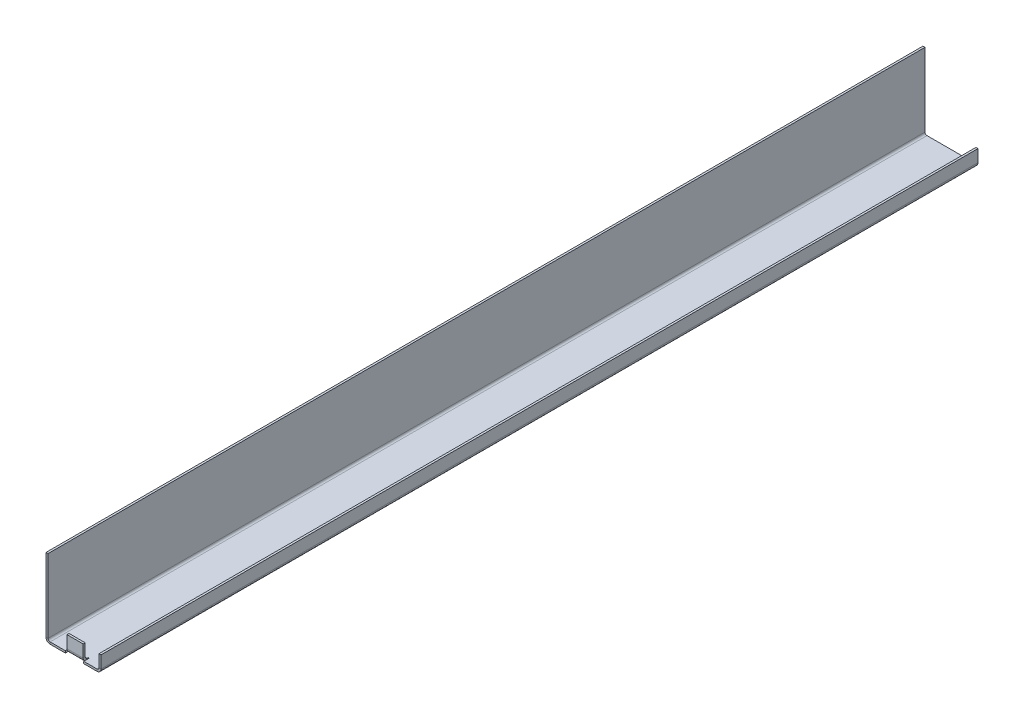
ISO-10303-21;
HEADER;
FILE_DESCRIPTION(('STEP AP214'),'2;1');
FILE_NAME('part.step','',(''),(''),'','','');
FILE_SCHEMA(('AUTOMOTIVE_DESIGN { 1 0 10303 214 1 1 1 1 }'));
ENDSEC;
DATA;
#1=APPLICATION_CONTEXT('core data for automotive mechanical design processes');
#2=APPLICATION_PROTOCOL_DEFINITION('international standard','automotive_design',2000,#1);
#3=PRODUCT_CONTEXT('',#1,'mechanical');
#4=PRODUCT('Part','Part','',(#3));
#5=PRODUCT_RELATED_PRODUCT_CATEGORY('part','',(#4));
#6=PRODUCT_DEFINITION_FORMATION('','',#4);
#7=PRODUCT_DEFINITION_CONTEXT('part definition',#1,'design');
#8=PRODUCT_DEFINITION('design','',#6,#7);
#9=PRODUCT_DEFINITION_SHAPE('','',#8);
#10=(LENGTH_UNIT() NAMED_UNIT(*) SI_UNIT(.MILLI.,.METRE.));
#11=(NAMED_UNIT(*) PLANE_ANGLE_UNIT() SI_UNIT($,.RADIAN.));
#12=(NAMED_UNIT(*) SI_UNIT($,.STERADIAN.) SOLID_ANGLE_UNIT());
#13=UNCERTAINTY_MEASURE_WITH_UNIT(LENGTH_MEASURE(1.E-05),#10,'distance_accuracy_value','');
#14=(GEOMETRIC_REPRESENTATION_CONTEXT(3) GLOBAL_UNCERTAINTY_ASSIGNED_CONTEXT((#13)) GLOBAL_UNIT_ASSIGNED_CONTEXT((#10,
#11,#12)) REPRESENTATION_CONTEXT('',''));
#15=CARTESIAN_POINT('',(0.,0.,0.));
#16=DIRECTION('',(0.,0.,1.));
#17=DIRECTION('',(1.,0.,0.));
#18=AXIS2_PLACEMENT_3D('',#15,#16,#17);
#19=CARTESIAN_POINT('',(82.55,6.35,1365.25));
#20=DIRECTION('',(0.,0.,1.));
#21=DIRECTION('',(1.,0.,0.));
#22=AXIS2_PLACEMENT_3D('',#19,#20,#21);
#23=PLANE('',#22);
#24=DIRECTION('',(1.,0.,0.));
#25=VECTOR('',#24,1.);
#26=CARTESIAN_POINT('',(0.,3.175,1365.25));
#27=LINE('',#26,#25);
#28=CARTESIAN_POINT('',(79.375,3.175,1365.25));
#29=VERTEX_POINT('',#28);
#30=CARTESIAN_POINT('',(58.7375,3.175,1365.25));
#31=VERTEX_POINT('',#30);
#32=EDGE_CURVE('E357',#29,#31,#27,.F.);
#33=ORIENTED_EDGE('',*,*,#32,.T.);
#34=DIRECTION('',(0.,-1.,0.));
#35=VECTOR('',#34,1.);
#36=CARTESIAN_POINT('',(58.7375,3.17499999999996,1365.25));
#37=LINE('',#36,#35);
#38=CARTESIAN_POINT('',(58.7375,0.,1365.25));
#39=VERTEX_POINT('',#38);
#40=EDGE_CURVE('E285',#31,#39,#37,.T.);
#41=ORIENTED_EDGE('',*,*,#40,.T.);
#42=DIRECTION('',(-1.,0.,0.));
#43=VECTOR('',#42,1.);
#44=CARTESIAN_POINT('',(0.,0.,1365.25));
#45=LINE('',#44,#43);
#46=CARTESIAN_POINT('',(79.375,0.,1365.25));
#47=VERTEX_POINT('',#46);
#48=EDGE_CURVE('E339',#47,#39,#45,.T.);
#49=ORIENTED_EDGE('',*,*,#48,.F.);
#50=DIRECTION('',(0.,1.,0.));
#51=VECTOR('',#50,1.);
#52=CARTESIAN_POINT('',(79.375,0.,1365.25));
#53=LINE('',#52,#51);
#54=EDGE_CURVE('E13',#47,#29,#53,.T.);
#55=ORIENTED_EDGE('',*,*,#54,.T.);
#56=EDGE_LOOP('',(#33,#41,#49,#55));
#57=FACE_BOUND('',#56,.T.);
#58=ADVANCED_FACE('F55',(#57),#23,.T.);
#59=CARTESIAN_POINT('',(30.1625,0.,1365.25));
#60=VERTEX_POINT('',#59);
#61=CARTESIAN_POINT('',(6.35,0.,1365.25));
#62=VERTEX_POINT('',#61);
#63=EDGE_CURVE('E338',#60,#62,#45,.T.);
#64=ORIENTED_EDGE('',*,*,#63,.F.);
#65=DIRECTION('',(0.,-1.,0.));
#66=VECTOR('',#65,1.);
#67=CARTESIAN_POINT('',(30.1625,3.17499999999996,1365.25));
#68=LINE('',#67,#66);
#69=CARTESIAN_POINT('',(30.1625,3.17499999999996,1365.25));
#70=VERTEX_POINT('',#69);
#71=EDGE_CURVE('E304',#70,#60,#68,.T.);
#72=ORIENTED_EDGE('',*,*,#71,.F.);
#73=CARTESIAN_POINT('',(6.35,3.175,1365.25));
#74=VERTEX_POINT('',#73);
#75=EDGE_CURVE('E356',#70,#74,#27,.F.);
#76=ORIENTED_EDGE('',*,*,#75,.T.);
#77=DIRECTION('',(0.,-1.,0.));
#78=VECTOR('',#77,1.);
#79=CARTESIAN_POINT('',(6.35,3.175,1365.25));
#80=LINE('',#79,#78);
#81=EDGE_CURVE('E433',#74,#62,#80,.T.);
#82=ORIENTED_EDGE('',*,*,#81,.T.);
#83=EDGE_LOOP('',(#64,#72,#76,#82));
#84=FACE_BOUND('',#83,.T.);
#85=ADVANCED_FACE('F501',(#84),#23,.T.);
#86=CARTESIAN_POINT('',(0.,0.,1365.25));
#87=DIRECTION('',(0.,-1.,0.));
#88=DIRECTION('',(0.,0.,-1.));
#89=AXIS2_PLACEMENT_3D('',#86,#87,#88);
#90=PLANE('',#89);
#91=ORIENTED_EDGE('',*,*,#48,.T.);
#92=DIRECTION('',(0.,0.,-1.));
#93=VECTOR('',#92,1.);
#94=CARTESIAN_POINT('',(58.7375,0.,1365.25));
#95=LINE('',#94,#93);
#96=CARTESIAN_POINT('',(58.7375,0.,1356.5505));
#97=VERTEX_POINT('',#96);
#98=EDGE_CURVE('E70',#39,#97,#95,.T.);
#99=ORIENTED_EDGE('',*,*,#98,.T.);
#100=DIRECTION('',(-1.,0.,0.));
#101=VECTOR('',#100,1.);
#102=CARTESIAN_POINT('',(0.,0.,1356.5505));
#103=LINE('',#102,#101);
#104=CARTESIAN_POINT('',(57.15,0.,1356.5505));
#105=VERTEX_POINT('',#104);
#106=EDGE_CURVE('E74',#97,#105,#103,.T.);
#107=ORIENTED_EDGE('',*,*,#106,.T.);
#108=DIRECTION('',(0.,0.,1.));
#109=VECTOR('',#108,1.);
#110=CARTESIAN_POINT('',(57.15,0.,1365.25));
#111=LINE('',#110,#109);
#112=CARTESIAN_POINT('',(57.15,0.,1358.138));
#113=VERTEX_POINT('',#112);
#114=EDGE_CURVE('E321',#105,#113,#111,.T.);
#115=ORIENTED_EDGE('',*,*,#114,.T.);
#116=DIRECTION('',(1.,0.,0.));
#117=VECTOR('',#116,1.);
#118=CARTESIAN_POINT('',(57.15,0.,1358.138));
#119=LINE('',#118,#117);
#120=CARTESIAN_POINT('',(31.75,0.,1358.138));
#121=VERTEX_POINT('',#120);
#122=EDGE_CURVE('E257',#113,#121,#119,.F.);
#123=ORIENTED_EDGE('',*,*,#122,.T.);
#124=DIRECTION('',(0.,0.,-1.));
#125=VECTOR('',#124,1.);
#126=CARTESIAN_POINT('',(31.75,0.,1365.25));
#127=LINE('',#126,#125);
#128=CARTESIAN_POINT('',(31.75,0.,1356.5505));
#129=VERTEX_POINT('',#128);
#130=EDGE_CURVE('E319',#121,#129,#127,.T.);
#131=ORIENTED_EDGE('',*,*,#130,.T.);
#132=DIRECTION('',(-1.,0.,0.));
#133=VECTOR('',#132,1.);
#134=CARTESIAN_POINT('',(0.,0.,1356.5505));
#135=LINE('',#134,#133);
#136=CARTESIAN_POINT('',(30.1625,0.,1356.5505));
#137=VERTEX_POINT('',#136);
#138=EDGE_CURVE('E317',#129,#137,#135,.T.);
#139=ORIENTED_EDGE('',*,*,#138,.T.);
#140=DIRECTION('',(0.,0.,1.));
#141=VECTOR('',#140,1.);
#142=CARTESIAN_POINT('',(30.1625,0.,1365.25));
#143=LINE('',#142,#141);
#144=EDGE_CURVE('E284',#137,#60,#143,.T.);
#145=ORIENTED_EDGE('',*,*,#144,.T.);
#146=ORIENTED_EDGE('',*,*,#63,.T.);
#147=DIRECTION('',(0.,0.,-1.));
#148=VECTOR('',#147,1.);
#149=CARTESIAN_POINT('',(6.35,0.,1365.25));
#150=LINE('',#149,#148);
#151=CARTESIAN_POINT('',(6.35,0.,0.));
#152=VERTEX_POINT('',#151);
#153=EDGE_CURVE('E419',#62,#152,#150,.T.);
#154=ORIENTED_EDGE('',*,*,#153,.T.);
#155=DIRECTION('',(-1.,0.,0.));
#156=VECTOR('',#155,1.);
#157=CARTESIAN_POINT('',(0.,0.,0.));
#158=LINE('',#157,#156);
#159=CARTESIAN_POINT('',(79.375,0.,0.));
#160=VERTEX_POINT('',#159);
#161=EDGE_CURVE('E375',#160,#152,#158,.T.);
#162=ORIENTED_EDGE('',*,*,#161,.F.);
#163=DIRECTION('',(0.,0.,-1.));
#164=VECTOR('',#163,1.);
#165=CARTESIAN_POINT('',(79.375,0.,1365.25));
#166=LINE('',#165,#164);
#167=EDGE_CURVE('E416',#47,#160,#166,.T.);
#168=ORIENTED_EDGE('',*,*,#167,.F.);
#169=EDGE_LOOP('',(#91,#99,#107,#115,#123,#131,#139,#145,#146,#154,#162,#168));
#170=FACE_BOUND('',#169,.T.);
#171=ADVANCED_FACE('F483',(#170),#90,.T.);
#172=CARTESIAN_POINT('',(0.,3.175,1365.25));
#173=DIRECTION('',(0.,-1.,0.));
#174=DIRECTION('',(0.,0.,-1.));
#175=AXIS2_PLACEMENT_3D('',#172,#173,#174);
#176=PLANE('',#175);
#177=DIRECTION('',(0.,0.,-1.));
#178=VECTOR('',#177,1.);
#179=CARTESIAN_POINT('',(58.7375,3.17499999999996,1365.25));
#180=LINE('',#179,#178);
#181=CARTESIAN_POINT('',(58.7375,3.175,1356.5505));
#182=VERTEX_POINT('',#181);
#183=EDGE_CURVE('E281',#31,#182,#180,.T.);
#184=ORIENTED_EDGE('',*,*,#183,.F.);
#185=ORIENTED_EDGE('',*,*,#32,.F.);
#186=DIRECTION('',(0.,0.,-1.));
#187=VECTOR('',#186,1.);
#188=CARTESIAN_POINT('',(79.375,3.175,1365.25));
#189=LINE('',#188,#187);
#190=CARTESIAN_POINT('',(79.375,3.175,0.));
#191=VERTEX_POINT('',#190);
#192=EDGE_CURVE('E403',#29,#191,#189,.T.);
#193=ORIENTED_EDGE('',*,*,#192,.T.);
#194=DIRECTION('',(1.,0.,0.));
#195=VECTOR('',#194,1.);
#196=CARTESIAN_POINT('',(0.,3.175,0.));
#197=LINE('',#196,#195);
#198=CARTESIAN_POINT('',(6.35,3.175,0.));
#199=VERTEX_POINT('',#198);
#200=EDGE_CURVE('E393',#191,#199,#197,.F.);
#201=ORIENTED_EDGE('',*,*,#200,.T.);
#202=DIRECTION('',(0.,0.,-1.));
#203=VECTOR('',#202,1.);
#204=CARTESIAN_POINT('',(6.35,3.175,1365.25));
#205=LINE('',#204,#203);
#206=EDGE_CURVE('E400',#74,#199,#205,.T.);
#207=ORIENTED_EDGE('',*,*,#206,.F.);
#208=ORIENTED_EDGE('',*,*,#75,.F.);
#209=DIRECTION('',(0.,0.,1.));
#210=VECTOR('',#209,1.);
#211=CARTESIAN_POINT('',(30.1625,3.17499999999993,1356.5505));
#212=LINE('',#211,#210);
#213=CARTESIAN_POINT('',(30.1625,3.175,1356.5505));
#214=VERTEX_POINT('',#213);
#215=EDGE_CURVE('E301',#214,#70,#212,.T.);
#216=ORIENTED_EDGE('',*,*,#215,.F.);
#217=DIRECTION('',(-1.,0.,0.));
#218=VECTOR('',#217,1.);
#219=CARTESIAN_POINT('',(31.75,3.17499999999993,1356.5505));
#220=LINE('',#219,#218);
#221=CARTESIAN_POINT('',(31.75,3.175,1356.5505));
#222=VERTEX_POINT('',#221);
#223=EDGE_CURVE('E297',#222,#214,#220,.T.);
#224=ORIENTED_EDGE('',*,*,#223,.F.);
#225=DIRECTION('',(0.,0.,-1.));
#226=VECTOR('',#225,1.);
#227=CARTESIAN_POINT('',(31.75,3.17499999999993,1358.138));
#228=LINE('',#227,#226);
#229=CARTESIAN_POINT('',(31.75,3.17499999999993,1358.138));
#230=VERTEX_POINT('',#229);
#231=EDGE_CURVE('E294',#230,#222,#228,.T.);
#232=ORIENTED_EDGE('',*,*,#231,.F.);
#233=DIRECTION('',(1.,0.,0.));
#234=VECTOR('',#233,1.);
#235=CARTESIAN_POINT('',(57.15,3.17499999999993,1358.138));
#236=LINE('',#235,#234);
#237=CARTESIAN_POINT('',(57.15,3.17499999999993,1358.138));
#238=VERTEX_POINT('',#237);
#239=EDGE_CURVE('E270',#238,#230,#236,.F.);
#240=ORIENTED_EDGE('',*,*,#239,.F.);
#241=DIRECTION('',(0.,0.,1.));
#242=VECTOR('',#241,1.);
#243=CARTESIAN_POINT('',(57.15,3.17499999999993,1356.5505));
#244=LINE('',#243,#242);
#245=CARTESIAN_POINT('',(57.15,3.175,1356.5505));
#246=VERTEX_POINT('',#245);
#247=EDGE_CURVE('E290',#246,#238,#244,.T.);
#248=ORIENTED_EDGE('',*,*,#247,.F.);
#249=DIRECTION('',(-1.,0.,0.));
#250=VECTOR('',#249,1.);
#251=CARTESIAN_POINT('',(58.7375,3.17499999999993,1356.5505));
#252=LINE('',#251,#250);
#253=EDGE_CURVE('E286',#182,#246,#252,.T.);
#254=ORIENTED_EDGE('',*,*,#253,.F.);
#255=EDGE_LOOP('',(#184,#185,#193,#201,#207,#208,#216,#224,#232,#240,#248,#254));
#256=FACE_BOUND('',#255,.T.);
#257=ADVANCED_FACE('F471',(#256),#176,.F.);
#258=CARTESIAN_POINT('',(79.375,0.,1365.25));
#259=DIRECTION('',(0.,0.,1.));
#260=DIRECTION('',(1.,0.,0.));
#261=AXIS2_PLACEMENT_3D('',#258,#259,#260);
#262=PLANE('',#261);
#263=ORIENTED_EDGE('',*,*,#54,.F.);
#264=CARTESIAN_POINT('',(79.375,6.35,1365.25));
#265=DIRECTION('',(0.,0.,1.));
#266=DIRECTION('',(1.,0.,0.));
#267=AXIS2_PLACEMENT_3D('',#264,#265,#266);
#268=CIRCLE('',#267,6.35);
#269=CARTESIAN_POINT('',(85.725,6.35,1365.25));
#270=VERTEX_POINT('',#269);
#271=EDGE_CURVE('E341',#270,#47,#268,.F.);
#272=ORIENTED_EDGE('',*,*,#271,.F.);
#273=DIRECTION('',(1.,0.,0.));
#274=VECTOR('',#273,1.);
#275=CARTESIAN_POINT('',(82.55,6.35,1365.25));
#276=LINE('',#275,#274);
#277=CARTESIAN_POINT('',(82.55,6.35,1365.25));
#278=VERTEX_POINT('',#277);
#279=EDGE_CURVE('E63',#278,#270,#276,.T.);
#280=ORIENTED_EDGE('',*,*,#279,.F.);
#281=CARTESIAN_POINT('',(79.375,6.35,1365.25));
#282=DIRECTION('',(0.,0.,1.));
#283=DIRECTION('',(1.,0.,0.));
#284=AXIS2_PLACEMENT_3D('',#281,#282,#283);
#285=CIRCLE('',#284,3.175);
#286=EDGE_CURVE('E353',#278,#29,#285,.F.);
#287=ORIENTED_EDGE('',*,*,#286,.T.);
#288=EDGE_LOOP('',(#263,#272,#280,#287));
#289=FACE_BOUND('',#288,.T.);
#290=ADVANCED_FACE('F57',(#289),#262,.T.);
#291=CARTESIAN_POINT('',(85.725,6.35,0.));
#292=DIRECTION('',(0.,0.,-1.));
#293=DIRECTION('',(-1.,0.,0.));
#294=AXIS2_PLACEMENT_3D('',#291,#292,#293);
#295=PLANE('',#294);
#296=DIRECTION('',(-1.,0.,0.));
#297=VECTOR('',#296,1.);
#298=CARTESIAN_POINT('',(85.725,6.35,0.));
#299=LINE('',#298,#297);
#300=CARTESIAN_POINT('',(85.725,6.35,0.));
#301=VERTEX_POINT('',#300);
#302=CARTESIAN_POINT('',(82.55,6.35,0.));
#303=VERTEX_POINT('',#302);
#304=EDGE_CURVE('E440',#301,#303,#299,.T.);
#305=ORIENTED_EDGE('',*,*,#304,.F.);
#306=CARTESIAN_POINT('',(79.375,6.35,0.));
#307=DIRECTION('',(0.,0.,1.));
#308=DIRECTION('',(1.,0.,0.));
#309=AXIS2_PLACEMENT_3D('',#306,#307,#308);
#310=CIRCLE('',#309,6.35);
#311=EDGE_CURVE('E378',#301,#160,#310,.F.);
#312=ORIENTED_EDGE('',*,*,#311,.T.);
#313=DIRECTION('',(0.,-1.,0.));
#314=VECTOR('',#313,1.);
#315=CARTESIAN_POINT('',(79.375,3.175,0.));
#316=LINE('',#315,#314);
#317=EDGE_CURVE('E438',#191,#160,#316,.T.);
#318=ORIENTED_EDGE('',*,*,#317,.F.);
#319=CARTESIAN_POINT('',(79.375,6.35,0.));
#320=DIRECTION('',(0.,0.,1.));
#321=DIRECTION('',(1.,0.,0.));
#322=AXIS2_PLACEMENT_3D('',#319,#320,#321);
#323=CIRCLE('',#322,3.175);
#324=EDGE_CURVE('E390',#303,#191,#323,.F.);
#325=ORIENTED_EDGE('',*,*,#324,.F.);
#326=EDGE_LOOP('',(#305,#312,#318,#325));
#327=FACE_BOUND('',#326,.T.);
#328=ADVANCED_FACE('F515',(#327),#295,.T.);
#329=CARTESIAN_POINT('',(79.375,3.175,0.));
#330=DIRECTION('',(0.,0.,-1.));
#331=DIRECTION('',(-1.,0.,0.));
#332=AXIS2_PLACEMENT_3D('',#329,#330,#331);
#333=PLANE('',#332);
#334=DIRECTION('',(0.,-1.,0.));
#335=VECTOR('',#334,1.);
#336=CARTESIAN_POINT('',(85.725,0.,0.));
#337=LINE('',#336,#335);
#338=CARTESIAN_POINT('',(85.725,25.4,0.));
#339=VERTEX_POINT('',#338);
#340=EDGE_CURVE('E381',#339,#301,#337,.T.);
#341=ORIENTED_EDGE('',*,*,#340,.T.);
#342=ORIENTED_EDGE('',*,*,#304,.T.);
#343=DIRECTION('',(0.,-1.,0.));
#344=VECTOR('',#343,1.);
#345=CARTESIAN_POINT('',(82.55,0.,0.));
#346=LINE('',#345,#344);
#347=CARTESIAN_POINT('',(82.55,25.4,0.));
#348=VERTEX_POINT('',#347);
#349=EDGE_CURVE('E387',#348,#303,#346,.T.);
#350=ORIENTED_EDGE('',*,*,#349,.F.);
#351=DIRECTION('',(1.,0.,0.));
#352=VECTOR('',#351,1.);
#353=CARTESIAN_POINT('',(82.55,25.4,0.));
#354=LINE('',#353,#352);
#355=EDGE_CURVE('E384',#348,#339,#354,.T.);
#356=ORIENTED_EDGE('',*,*,#355,.T.);
#357=EDGE_LOOP('',(#341,#342,#350,#356));
#358=FACE_BOUND('',#357,.T.);
#359=ADVANCED_FACE('F517',(#358),#333,.T.);
#360=CARTESIAN_POINT('',(0.,6.35,1365.25));
#361=DIRECTION('',(0.,0.,1.));
#362=DIRECTION('',(1.,0.,0.));
#363=AXIS2_PLACEMENT_3D('',#360,#361,#362);
#364=PLANE('',#363);
#365=DIRECTION('',(1.,0.,0.));
#366=VECTOR('',#365,1.);
#367=CARTESIAN_POINT('',(0.,6.35,1365.25));
#368=LINE('',#367,#366);
#369=CARTESIAN_POINT('',(0.,6.35,1365.25));
#370=VERTEX_POINT('',#369);
#371=CARTESIAN_POINT('',(3.175,6.35,1365.25));
#372=VERTEX_POINT('',#371);
#373=EDGE_CURVE('E436',#370,#372,#368,.T.);
#374=ORIENTED_EDGE('',*,*,#373,.F.);
#375=CARTESIAN_POINT('',(6.35,6.35,1365.25));
#376=DIRECTION('',(0.,0.,1.));
#377=DIRECTION('',(1.,0.,0.));
#378=AXIS2_PLACEMENT_3D('',#375,#376,#377);
#379=CIRCLE('',#378,6.35);
#380=EDGE_CURVE('E335',#62,#370,#379,.F.);
#381=ORIENTED_EDGE('',*,*,#380,.F.);
#382=ORIENTED_EDGE('',*,*,#81,.F.);
#383=CARTESIAN_POINT('',(6.35,6.35,1365.25));
#384=DIRECTION('',(0.,0.,1.));
#385=DIRECTION('',(1.,0.,0.));
#386=AXIS2_PLACEMENT_3D('',#383,#384,#385);
#387=CIRCLE('',#386,3.175);
#388=EDGE_CURVE('E360',#74,#372,#387,.F.);
#389=ORIENTED_EDGE('',*,*,#388,.T.);
#390=EDGE_LOOP('',(#374,#381,#382,#389));
#391=FACE_BOUND('',#390,.T.);
#392=ADVANCED_FACE('F519',(#391),#364,.T.);
#393=CARTESIAN_POINT('',(6.35,3.175,1365.25));
#394=DIRECTION('',(0.,0.,1.));
#395=DIRECTION('',(1.,0.,0.));
#396=AXIS2_PLACEMENT_3D('',#393,#394,#395);
#397=PLANE('',#396);
#398=DIRECTION('',(0.,1.,0.));
#399=VECTOR('',#398,1.);
#400=CARTESIAN_POINT('',(0.,0.,1365.25));
#401=LINE('',#400,#399);
#402=CARTESIAN_POINT('',(0.,120.65,1365.25));
#403=VERTEX_POINT('',#402);
#404=EDGE_CURVE('E332',#370,#403,#401,.T.);
#405=ORIENTED_EDGE('',*,*,#404,.F.);
#406=ORIENTED_EDGE('',*,*,#373,.T.);
#407=DIRECTION('',(0.,1.,0.));
#408=VECTOR('',#407,1.);
#409=CARTESIAN_POINT('',(3.175,0.,1365.25));
#410=LINE('',#409,#408);
#411=CARTESIAN_POINT('',(3.175,120.65,1365.25));
#412=VERTEX_POINT('',#411);
#413=EDGE_CURVE('E326',#372,#412,#410,.T.);
#414=ORIENTED_EDGE('',*,*,#413,.T.);
#415=DIRECTION('',(1.,0.,0.));
#416=VECTOR('',#415,1.);
#417=CARTESIAN_POINT('',(0.,120.65,1365.25));
#418=LINE('',#417,#416);
#419=EDGE_CURVE('E328',#403,#412,#418,.T.);
#420=ORIENTED_EDGE('',*,*,#419,.F.);
#421=EDGE_LOOP('',(#405,#406,#414,#420));
#422=FACE_BOUND('',#421,.T.);
#423=ADVANCED_FACE('F525',(#422),#397,.T.);
#424=CARTESIAN_POINT('',(6.35,0.,0.));
#425=DIRECTION('',(0.,0.,-1.));
#426=DIRECTION('',(-1.,0.,0.));
#427=AXIS2_PLACEMENT_3D('',#424,#425,#426);
#428=PLANE('',#427);
#429=DIRECTION('',(0.,1.,0.));
#430=VECTOR('',#429,1.);
#431=CARTESIAN_POINT('',(6.35,0.,0.));
#432=LINE('',#431,#430);
#433=EDGE_CURVE('E431',#152,#199,#432,.T.);
#434=ORIENTED_EDGE('',*,*,#433,.F.);
#435=CARTESIAN_POINT('',(6.35,6.35,0.));
#436=DIRECTION('',(0.,0.,1.));
#437=DIRECTION('',(1.,0.,0.));
#438=AXIS2_PLACEMENT_3D('',#435,#436,#437);
#439=CIRCLE('',#438,6.35);
#440=CARTESIAN_POINT('',(0.,6.35,0.));
#441=VERTEX_POINT('',#440);
#442=EDGE_CURVE('E372',#152,#441,#439,.F.);
#443=ORIENTED_EDGE('',*,*,#442,.T.);
#444=DIRECTION('',(-1.,0.,0.));
#445=VECTOR('',#444,1.);
#446=CARTESIAN_POINT('',(3.175,6.35,0.));
#447=LINE('',#446,#445);
#448=CARTESIAN_POINT('',(3.175,6.35,0.));
#449=VERTEX_POINT('',#448);
#450=EDGE_CURVE('E429',#449,#441,#447,.T.);
#451=ORIENTED_EDGE('',*,*,#450,.F.);
#452=CARTESIAN_POINT('',(6.35,6.35,0.));
#453=DIRECTION('',(0.,0.,1.));
#454=DIRECTION('',(1.,0.,0.));
#455=AXIS2_PLACEMENT_3D('',#452,#453,#454);
#456=CIRCLE('',#455,3.175);
#457=EDGE_CURVE('E329',#199,#449,#456,.F.);
#458=ORIENTED_EDGE('',*,*,#457,.F.);
#459=EDGE_LOOP('',(#434,#443,#451,#458));
#460=FACE_BOUND('',#459,.T.);
#461=ADVANCED_FACE('F560',(#460),#428,.T.);
#462=CARTESIAN_POINT('',(3.175,6.35,0.));
#463=DIRECTION('',(0.,0.,-1.));
#464=DIRECTION('',(-1.,0.,0.));
#465=AXIS2_PLACEMENT_3D('',#462,#463,#464);
#466=PLANE('',#465);
#467=ORIENTED_EDGE('',*,*,#161,.T.);
#468=ORIENTED_EDGE('',*,*,#433,.T.);
#469=ORIENTED_EDGE('',*,*,#200,.F.);
#470=ORIENTED_EDGE('',*,*,#317,.T.);
#471=EDGE_LOOP('',(#467,#468,#469,#470));
#472=FACE_BOUND('',#471,.T.);
#473=ADVANCED_FACE('F513',(#472),#466,.T.);
#474=CARTESIAN_POINT('',(3.175,0.,1365.25));
#475=DIRECTION('',(-1.,0.,0.));
#476=DIRECTION('',(0.,0.,1.));
#477=AXIS2_PLACEMENT_3D('',#474,#475,#476);
#478=PLANE('',#477);
#479=DIRECTION('',(0.,1.,0.));
#480=VECTOR('',#479,1.);
#481=CARTESIAN_POINT('',(3.175,0.,0.));
#482=LINE('',#481,#480);
#483=CARTESIAN_POINT('',(3.175,120.65,0.));
#484=VERTEX_POINT('',#483);
#485=EDGE_CURVE('E325',#449,#484,#482,.T.);
#486=ORIENTED_EDGE('',*,*,#485,.T.);
#487=DIRECTION('',(0.,0.,-1.));
#488=VECTOR('',#487,1.);
#489=CARTESIAN_POINT('',(3.175,120.65,1365.25));
#490=LINE('',#489,#488);
#491=EDGE_CURVE('E427',#412,#484,#490,.T.);
#492=ORIENTED_EDGE('',*,*,#491,.F.);
#493=ORIENTED_EDGE('',*,*,#413,.F.);
#494=DIRECTION('',(0.,0.,-1.));
#495=VECTOR('',#494,1.);
#496=CARTESIAN_POINT('',(3.175,6.35,1365.25));
#497=LINE('',#496,#495);
#498=EDGE_CURVE('E363',#372,#449,#497,.T.);
#499=ORIENTED_EDGE('',*,*,#498,.T.);
#500=EDGE_LOOP('',(#486,#492,#493,#499));
#501=FACE_BOUND('',#500,.T.);
#502=ADVANCED_FACE('F553',(#501),#478,.F.);
#503=CARTESIAN_POINT('',(0.,120.65,1365.25));
#504=DIRECTION('',(0.,1.,0.));
#505=DIRECTION('',(0.,0.,1.));
#506=AXIS2_PLACEMENT_3D('',#503,#504,#505);
#507=PLANE('',#506);
#508=DIRECTION('',(1.,0.,0.));
#509=VECTOR('',#508,1.);
#510=CARTESIAN_POINT('',(0.,120.65,0.));
#511=LINE('',#510,#509);
#512=CARTESIAN_POINT('',(0.,120.65,0.));
#513=VERTEX_POINT('',#512);
#514=EDGE_CURVE('E366',#513,#484,#511,.T.);
#515=ORIENTED_EDGE('',*,*,#514,.F.);
#516=DIRECTION('',(0.,0.,-1.));
#517=VECTOR('',#516,1.);
#518=CARTESIAN_POINT('',(0.,120.65,1365.25));
#519=LINE('',#518,#517);
#520=EDGE_CURVE('E425',#403,#513,#519,.T.);
#521=ORIENTED_EDGE('',*,*,#520,.F.);
#522=ORIENTED_EDGE('',*,*,#419,.T.);
#523=ORIENTED_EDGE('',*,*,#491,.T.);
#524=EDGE_LOOP('',(#515,#521,#522,#523));
#525=FACE_BOUND('',#524,.T.);
#526=ADVANCED_FACE('F549',(#525),#507,.T.);
#527=CARTESIAN_POINT('',(0.,0.,1365.25));
#528=DIRECTION('',(-1.,0.,0.));
#529=DIRECTION('',(0.,0.,1.));
#530=AXIS2_PLACEMENT_3D('',#527,#528,#529);
#531=PLANE('',#530);
#532=DIRECTION('',(0.,1.,0.));
#533=VECTOR('',#532,1.);
#534=CARTESIAN_POINT('',(0.,0.,0.));
#535=LINE('',#534,#533);
#536=EDGE_CURVE('E369',#441,#513,#535,.T.);
#537=ORIENTED_EDGE('',*,*,#536,.F.);
#538=DIRECTION('',(0.,0.,-1.));
#539=VECTOR('',#538,1.);
#540=CARTESIAN_POINT('',(0.,6.35,1365.25));
#541=LINE('',#540,#539);
#542=EDGE_CURVE('E422',#370,#441,#541,.T.);
#543=ORIENTED_EDGE('',*,*,#542,.F.);
#544=ORIENTED_EDGE('',*,*,#404,.T.);
#545=ORIENTED_EDGE('',*,*,#520,.T.);
#546=EDGE_LOOP('',(#537,#543,#544,#545));
#547=FACE_BOUND('',#546,.T.);
#548=ADVANCED_FACE('F546',(#547),#531,.T.);
#549=CARTESIAN_POINT('',(6.35,6.35,1365.25));
#550=DIRECTION('',(0.,0.,-1.));
#551=DIRECTION('',(-1.,0.,0.));
#552=AXIS2_PLACEMENT_3D('',#549,#550,#551);
#553=CYLINDRICAL_SURFACE('',#552,6.35);
#554=ORIENTED_EDGE('',*,*,#442,.F.);
#555=ORIENTED_EDGE('',*,*,#153,.F.);
#556=ORIENTED_EDGE('',*,*,#380,.T.);
#557=ORIENTED_EDGE('',*,*,#542,.T.);
#558=EDGE_LOOP('',(#554,#555,#556,#557));
#559=FACE_BOUND('',#558,.T.);
#560=ADVANCED_FACE('F508',(#559),#553,.T.);
#561=CARTESIAN_POINT('',(79.375,6.35,1365.25));
#562=DIRECTION('',(0.,0.,-1.));
#563=DIRECTION('',(-1.,0.,0.));
#564=AXIS2_PLACEMENT_3D('',#561,#562,#563);
#565=CYLINDRICAL_SURFACE('',#564,6.35);
#566=ORIENTED_EDGE('',*,*,#311,.F.);
#567=DIRECTION('',(0.,0.,-1.));
#568=VECTOR('',#567,1.);
#569=CARTESIAN_POINT('',(85.725,6.35,1365.25));
#570=LINE('',#569,#568);
#571=EDGE_CURVE('E413',#270,#301,#570,.T.);
#572=ORIENTED_EDGE('',*,*,#571,.F.);
#573=ORIENTED_EDGE('',*,*,#271,.T.);
#574=ORIENTED_EDGE('',*,*,#167,.T.);
#575=EDGE_LOOP('',(#566,#572,#573,#574));
#576=FACE_BOUND('',#575,.T.);
#577=ADVANCED_FACE('F452',(#576),#565,.T.);
#578=CARTESIAN_POINT('',(85.725,0.,1365.25));
#579=DIRECTION('',(1.,0.,0.));
#580=DIRECTION('',(0.,1.,0.));
#581=AXIS2_PLACEMENT_3D('',#578,#579,#580);
#582=PLANE('',#581);
#583=ORIENTED_EDGE('',*,*,#340,.F.);
#584=DIRECTION('',(0.,0.,-1.));
#585=VECTOR('',#584,1.);
#586=CARTESIAN_POINT('',(85.725,25.4,1365.25));
#587=LINE('',#586,#585);
#588=CARTESIAN_POINT('',(85.725,25.4,1365.25));
#589=VERTEX_POINT('',#588);
#590=EDGE_CURVE('E411',#589,#339,#587,.T.);
#591=ORIENTED_EDGE('',*,*,#590,.F.);
#592=DIRECTION('',(0.,-1.,0.));
#593=VECTOR('',#592,1.);
#594=CARTESIAN_POINT('',(85.725,0.,1365.25));
#595=LINE('',#594,#593);
#596=EDGE_CURVE('E344',#589,#270,#595,.T.);
#597=ORIENTED_EDGE('',*,*,#596,.T.);
#598=ORIENTED_EDGE('',*,*,#571,.T.);
#599=EDGE_LOOP('',(#583,#591,#597,#598));
#600=FACE_BOUND('',#599,.T.);
#601=ADVANCED_FACE('F456',(#600),#582,.T.);
#602=CARTESIAN_POINT('',(82.55,25.4,1365.25));
#603=DIRECTION('',(0.,1.,0.));
#604=DIRECTION('',(0.,0.,1.));
#605=AXIS2_PLACEMENT_3D('',#602,#603,#604);
#606=PLANE('',#605);
#607=ORIENTED_EDGE('',*,*,#355,.F.);
#608=DIRECTION('',(0.,0.,-1.));
#609=VECTOR('',#608,1.);
#610=CARTESIAN_POINT('',(82.55,25.4,1365.25));
#611=LINE('',#610,#609);
#612=CARTESIAN_POINT('',(82.55,25.4,1365.25));
#613=VERTEX_POINT('',#612);
#614=EDGE_CURVE('E409',#613,#348,#611,.T.);
#615=ORIENTED_EDGE('',*,*,#614,.F.);
#616=DIRECTION('',(1.,0.,0.));
#617=VECTOR('',#616,1.);
#618=CARTESIAN_POINT('',(82.55,25.4,1365.25));
#619=LINE('',#618,#617);
#620=EDGE_CURVE('E347',#613,#589,#619,.T.);
#621=ORIENTED_EDGE('',*,*,#620,.T.);
#622=ORIENTED_EDGE('',*,*,#590,.T.);
#623=EDGE_LOOP('',(#607,#615,#621,#622));
#624=FACE_BOUND('',#623,.T.);
#625=ADVANCED_FACE('F459',(#624),#606,.T.);
#626=CARTESIAN_POINT('',(82.55,0.,1365.25));
#627=DIRECTION('',(1.,0.,0.));
#628=DIRECTION('',(0.,1.,0.));
#629=AXIS2_PLACEMENT_3D('',#626,#627,#628);
#630=PLANE('',#629);
#631=ORIENTED_EDGE('',*,*,#349,.T.);
#632=DIRECTION('',(0.,0.,-1.));
#633=VECTOR('',#632,1.);
#634=CARTESIAN_POINT('',(82.55,6.35,1365.25));
#635=LINE('',#634,#633);
#636=EDGE_CURVE('E406',#278,#303,#635,.T.);
#637=ORIENTED_EDGE('',*,*,#636,.F.);
#638=DIRECTION('',(0.,-1.,0.));
#639=VECTOR('',#638,1.);
#640=CARTESIAN_POINT('',(82.55,0.,1365.25));
#641=LINE('',#640,#639);
#642=EDGE_CURVE('E350',#613,#278,#641,.T.);
#643=ORIENTED_EDGE('',*,*,#642,.F.);
#644=ORIENTED_EDGE('',*,*,#614,.T.);
#645=EDGE_LOOP('',(#631,#637,#643,#644));
#646=FACE_BOUND('',#645,.T.);
#647=ADVANCED_FACE('F462',(#646),#630,.F.);
#648=CARTESIAN_POINT('',(79.375,6.35,1365.25));
#649=DIRECTION('',(0.,0.,-1.));
#650=DIRECTION('',(-1.,0.,0.));
#651=AXIS2_PLACEMENT_3D('',#648,#649,#650);
#652=CYLINDRICAL_SURFACE('',#651,3.175);
#653=ORIENTED_EDGE('',*,*,#324,.T.);
#654=ORIENTED_EDGE('',*,*,#192,.F.);
#655=ORIENTED_EDGE('',*,*,#286,.F.);
#656=ORIENTED_EDGE('',*,*,#636,.T.);
#657=EDGE_LOOP('',(#653,#654,#655,#656));
#658=FACE_BOUND('',#657,.T.);
#659=ADVANCED_FACE('F467',(#658),#652,.F.);
#660=CARTESIAN_POINT('',(6.35,6.35,1365.25));
#661=DIRECTION('',(0.,0.,-1.));
#662=DIRECTION('',(-1.,0.,0.));
#663=AXIS2_PLACEMENT_3D('',#660,#661,#662);
#664=CYLINDRICAL_SURFACE('',#663,3.175);
#665=ORIENTED_EDGE('',*,*,#457,.T.);
#666=ORIENTED_EDGE('',*,*,#498,.F.);
#667=ORIENTED_EDGE('',*,*,#388,.F.);
#668=ORIENTED_EDGE('',*,*,#206,.T.);
#669=EDGE_LOOP('',(#665,#666,#667,#668));
#670=FACE_BOUND('',#669,.T.);
#671=ADVANCED_FACE('F578',(#670),#664,.F.);
#672=CARTESIAN_POINT('',(6.35,6.35,1365.25));
#673=DIRECTION('',(0.,0.,1.));
#674=DIRECTION('',(1.,0.,0.));
#675=AXIS2_PLACEMENT_3D('',#672,#673,#674);
#676=PLANE('',#675);
#677=ORIENTED_EDGE('',*,*,#642,.T.);
#678=ORIENTED_EDGE('',*,*,#279,.T.);
#679=ORIENTED_EDGE('',*,*,#596,.F.);
#680=ORIENTED_EDGE('',*,*,#620,.F.);
#681=EDGE_LOOP('',(#677,#678,#679,#680));
#682=FACE_BOUND('',#681,.T.);
#683=ADVANCED_FACE('F444',(#682),#676,.T.);
#684=CARTESIAN_POINT('',(6.35,6.35,0.));
#685=DIRECTION('',(0.,0.,1.));
#686=DIRECTION('',(1.,0.,0.));
#687=AXIS2_PLACEMENT_3D('',#684,#685,#686);
#688=PLANE('',#687);
#689=ORIENTED_EDGE('',*,*,#485,.F.);
#690=ORIENTED_EDGE('',*,*,#450,.T.);
#691=ORIENTED_EDGE('',*,*,#536,.T.);
#692=ORIENTED_EDGE('',*,*,#514,.T.);
#693=EDGE_LOOP('',(#689,#690,#691,#692));
#694=FACE_BOUND('',#693,.T.);
#695=ADVANCED_FACE('F575',(#694),#688,.F.);
#696=CARTESIAN_POINT('',(58.7375,3.17499999999996,1365.25));
#697=DIRECTION('',(-1.,0.,0.));
#698=DIRECTION('',(0.,0.,1.));
#699=AXIS2_PLACEMENT_3D('',#696,#697,#698);
#700=PLANE('',#699);
#701=ORIENTED_EDGE('',*,*,#98,.F.);
#702=ORIENTED_EDGE('',*,*,#40,.F.);
#703=ORIENTED_EDGE('',*,*,#183,.T.);
#704=DIRECTION('',(0.,-1.,0.));
#705=VECTOR('',#704,1.);
#706=CARTESIAN_POINT('',(58.7375,3.17499999999993,1356.5505));
#707=LINE('',#706,#705);
#708=EDGE_CURVE('E289',#182,#97,#707,.T.);
#709=ORIENTED_EDGE('',*,*,#708,.T.);
#710=EDGE_LOOP('',(#701,#702,#703,#709));
#711=FACE_BOUND('',#710,.T.);
#712=ADVANCED_FACE('F476',(#711),#700,.T.);
#713=CARTESIAN_POINT('',(58.7375,3.17499999999993,1356.5505));
#714=DIRECTION('',(0.,0.,1.));
#715=DIRECTION('',(0.,-1.,0.));
#716=AXIS2_PLACEMENT_3D('',#713,#714,#715);
#717=PLANE('',#716);
#718=ORIENTED_EDGE('',*,*,#106,.F.);
#719=ORIENTED_EDGE('',*,*,#708,.F.);
#720=ORIENTED_EDGE('',*,*,#253,.T.);
#721=DIRECTION('',(0.,-1.,0.));
#722=VECTOR('',#721,1.);
#723=CARTESIAN_POINT('',(57.15,3.17499999999993,1356.5505));
#724=LINE('',#723,#722);
#725=EDGE_CURVE('E293',#246,#105,#724,.T.);
#726=ORIENTED_EDGE('',*,*,#725,.T.);
#727=EDGE_LOOP('',(#718,#719,#720,#726));
#728=FACE_BOUND('',#727,.T.);
#729=ADVANCED_FACE('F479',(#728),#717,.T.);
#730=CARTESIAN_POINT('',(57.15,3.17499999999993,1356.5505));
#731=DIRECTION('',(1.,0.,0.));
#732=DIRECTION('',(0.,0.,-1.));
#733=AXIS2_PLACEMENT_3D('',#730,#731,#732);
#734=PLANE('',#733);
#735=ORIENTED_EDGE('',*,*,#114,.F.);
#736=ORIENTED_EDGE('',*,*,#725,.F.);
#737=ORIENTED_EDGE('',*,*,#247,.T.);
#738=DIRECTION('',(0.,-1.,0.));
#739=VECTOR('',#738,1.);
#740=CARTESIAN_POINT('',(57.15,3.17499999999993,1358.138));
#741=LINE('',#740,#739);
#742=EDGE_CURVE('E264',#238,#113,#741,.T.);
#743=ORIENTED_EDGE('',*,*,#742,.T.);
#744=EDGE_LOOP('',(#735,#736,#737,#743));
#745=FACE_BOUND('',#744,.T.);
#746=ADVANCED_FACE('F482',(#745),#734,.T.);
#747=CARTESIAN_POINT('',(31.75,3.17499999999993,1358.138));
#748=DIRECTION('',(-1.,0.,0.));
#749=DIRECTION('',(0.,0.,1.));
#750=AXIS2_PLACEMENT_3D('',#747,#748,#749);
#751=PLANE('',#750);
#752=ORIENTED_EDGE('',*,*,#130,.F.);
#753=DIRECTION('',(0.,-1.,0.));
#754=VECTOR('',#753,1.);
#755=CARTESIAN_POINT('',(31.75,3.17499999999993,1358.138));
#756=LINE('',#755,#754);
#757=EDGE_CURVE('E275',#230,#121,#756,.T.);
#758=ORIENTED_EDGE('',*,*,#757,.F.);
#759=ORIENTED_EDGE('',*,*,#231,.T.);
#760=DIRECTION('',(0.,-1.,0.));
#761=VECTOR('',#760,1.);
#762=CARTESIAN_POINT('',(31.75,3.17499999999993,1356.5505));
#763=LINE('',#762,#761);
#764=EDGE_CURVE('E300',#222,#129,#763,.T.);
#765=ORIENTED_EDGE('',*,*,#764,.T.);
#766=EDGE_LOOP('',(#752,#758,#759,#765));
#767=FACE_BOUND('',#766,.T.);
#768=ADVANCED_FACE('F489',(#767),#751,.T.);
#769=CARTESIAN_POINT('',(31.75,3.17499999999993,1356.5505));
#770=DIRECTION('',(0.,0.,1.));
#771=DIRECTION('',(0.,-1.,0.));
#772=AXIS2_PLACEMENT_3D('',#769,#770,#771);
#773=PLANE('',#772);
#774=ORIENTED_EDGE('',*,*,#138,.F.);
#775=ORIENTED_EDGE('',*,*,#764,.F.);
#776=ORIENTED_EDGE('',*,*,#223,.T.);
#777=DIRECTION('',(0.,-1.,0.));
#778=VECTOR('',#777,1.);
#779=CARTESIAN_POINT('',(30.1625,3.17499999999993,1356.5505));
#780=LINE('',#779,#778);
#781=EDGE_CURVE('E278',#214,#137,#780,.T.);
#782=ORIENTED_EDGE('',*,*,#781,.T.);
#783=EDGE_LOOP('',(#774,#775,#776,#782));
#784=FACE_BOUND('',#783,.T.);
#785=ADVANCED_FACE('F493',(#784),#773,.T.);
#786=CARTESIAN_POINT('',(30.1625,3.17499999999993,1356.5505));
#787=DIRECTION('',(1.,0.,0.));
#788=DIRECTION('',(0.,0.,-1.));
#789=AXIS2_PLACEMENT_3D('',#786,#787,#788);
#790=PLANE('',#789);
#791=ORIENTED_EDGE('',*,*,#144,.F.);
#792=ORIENTED_EDGE('',*,*,#781,.F.);
#793=ORIENTED_EDGE('',*,*,#215,.T.);
#794=ORIENTED_EDGE('',*,*,#71,.T.);
#795=EDGE_LOOP('',(#791,#792,#793,#794));
#796=FACE_BOUND('',#795,.T.);
#797=ADVANCED_FACE('F498',(#796),#790,.T.);
#798=CARTESIAN_POINT('',(31.75,6.34999999999986,1358.138));
#799=DIRECTION('',(-1.,0.,0.));
#800=DIRECTION('',(0.,0.,1.));
#801=AXIS2_PLACEMENT_3D('',#798,#799,#800);
#802=PLANE('',#801);
#803=DIRECTION('',(0.,0.,-1.));
#804=VECTOR('',#803,1.);
#805=CARTESIAN_POINT('',(31.75,6.34999999999986,1364.488));
#806=LINE('',#805,#804);
#807=CARTESIAN_POINT('',(31.75,6.34999999999986,1361.313));
#808=VERTEX_POINT('',#807);
#809=CARTESIAN_POINT('',(31.75,6.34999999999986,1364.488));
#810=VERTEX_POINT('',#809);
#811=EDGE_CURVE('E239',#808,#810,#806,.F.);
#812=ORIENTED_EDGE('',*,*,#811,.F.);
#813=CARTESIAN_POINT('',(31.75,6.34999999999986,1358.138));
#814=DIRECTION('',(1.,0.,0.));
#815=DIRECTION('',(0.,0.,-1.));
#816=AXIS2_PLACEMENT_3D('',#813,#814,#815);
#817=CIRCLE('',#816,3.17499999999993);
#818=EDGE_CURVE('E267',#230,#808,#817,.F.);
#819=ORIENTED_EDGE('',*,*,#818,.F.);
#820=ORIENTED_EDGE('',*,*,#757,.T.);
#821=CARTESIAN_POINT('',(31.75,6.34999999999986,1358.138));
#822=DIRECTION('',(1.,0.,0.));
#823=DIRECTION('',(0.,0.,-1.));
#824=AXIS2_PLACEMENT_3D('',#821,#822,#823);
#825=CIRCLE('',#824,6.34999999999993);
#826=EDGE_CURVE('E260',#121,#810,#825,.F.);
#827=ORIENTED_EDGE('',*,*,#826,.T.);
#828=EDGE_LOOP('',(#812,#819,#820,#827));
#829=FACE_BOUND('',#828,.T.);
#830=ADVANCED_FACE('F588',(#829),#802,.T.);
#831=CARTESIAN_POINT('',(57.15,6.34999999999986,1358.138));
#832=DIRECTION('',(-1.,0.,0.));
#833=DIRECTION('',(0.,0.,1.));
#834=AXIS2_PLACEMENT_3D('',#831,#832,#833);
#835=PLANE('',#834);
#836=CARTESIAN_POINT('',(57.15,6.34999999999986,1358.138));
#837=DIRECTION('',(1.,0.,0.));
#838=DIRECTION('',(0.,0.,-1.));
#839=AXIS2_PLACEMENT_3D('',#836,#837,#838);
#840=CIRCLE('',#839,3.17499999999993);
#841=CARTESIAN_POINT('',(57.15,6.34999999999986,1361.313));
#842=VERTEX_POINT('',#841);
#843=EDGE_CURVE('E272',#842,#238,#840,.T.);
#844=ORIENTED_EDGE('',*,*,#843,.F.);
#845=DIRECTION('',(0.,0.,-1.));
#846=VECTOR('',#845,1.);
#847=CARTESIAN_POINT('',(57.15,6.34999999999986,1361.313));
#848=LINE('',#847,#846);
#849=CARTESIAN_POINT('',(57.15,6.34999999999986,1364.488));
#850=VERTEX_POINT('',#849);
#851=EDGE_CURVE('E251',#842,#850,#848,.F.);
#852=ORIENTED_EDGE('',*,*,#851,.T.);
#853=CARTESIAN_POINT('',(57.15,6.34999999999986,1358.138));
#854=DIRECTION('',(1.,0.,0.));
#855=DIRECTION('',(0.,0.,-1.));
#856=AXIS2_PLACEMENT_3D('',#853,#854,#855);
#857=CIRCLE('',#856,6.34999999999993);
#858=EDGE_CURVE('E261',#850,#113,#857,.T.);
#859=ORIENTED_EDGE('',*,*,#858,.T.);
#860=ORIENTED_EDGE('',*,*,#742,.F.);
#861=EDGE_LOOP('',(#844,#852,#859,#860));
#862=FACE_BOUND('',#861,.T.);
#863=ADVANCED_FACE('F597',(#862),#835,.F.);
#864=CARTESIAN_POINT('',(57.15,6.34999999999986,1358.138));
#865=DIRECTION('',(1.,0.,0.));
#866=DIRECTION('',(0.,0.,1.));
#867=AXIS2_PLACEMENT_3D('',#864,#865,#866);
#868=CYLINDRICAL_SURFACE('',#867,6.34999999999993);
#869=ORIENTED_EDGE('',*,*,#122,.F.);
#870=ORIENTED_EDGE('',*,*,#858,.F.);
#871=DIRECTION('',(1.,0.,0.));
#872=VECTOR('',#871,1.);
#873=CARTESIAN_POINT('',(31.75,6.34999999999986,1364.488));
#874=LINE('',#873,#872);
#875=EDGE_CURVE('E249',#850,#810,#874,.F.);
#876=ORIENTED_EDGE('',*,*,#875,.T.);
#877=ORIENTED_EDGE('',*,*,#826,.F.);
#878=EDGE_LOOP('',(#869,#870,#876,#877));
#879=FACE_BOUND('',#878,.T.);
#880=ADVANCED_FACE('F589',(#879),#868,.T.);
#881=CARTESIAN_POINT('',(57.15,6.34999999999986,1358.138));
#882=DIRECTION('',(1.,0.,0.));
#883=DIRECTION('',(0.,0.,1.));
#884=AXIS2_PLACEMENT_3D('',#881,#882,#883);
#885=CYLINDRICAL_SURFACE('',#884,3.17499999999993);
#886=ORIENTED_EDGE('',*,*,#239,.T.);
#887=ORIENTED_EDGE('',*,*,#818,.T.);
#888=DIRECTION('',(1.,0.,0.));
#889=VECTOR('',#888,1.);
#890=CARTESIAN_POINT('',(31.75,6.34999999999986,1361.313));
#891=LINE('',#890,#889);
#892=EDGE_CURVE('E254',#808,#842,#891,.T.);
#893=ORIENTED_EDGE('',*,*,#892,.T.);
#894=ORIENTED_EDGE('',*,*,#843,.T.);
#895=EDGE_LOOP('',(#886,#887,#893,#894));
#896=FACE_BOUND('',#895,.T.);
#897=ADVANCED_FACE('F584',(#896),#885,.F.);
#898=CARTESIAN_POINT('',(57.15,25.4,1364.488));
#899=DIRECTION('',(-1.,0.,0.));
#900=DIRECTION('',(0.,-1.,0.));
#901=AXIS2_PLACEMENT_3D('',#898,#899,#900);
#902=PLANE('',#901);
#903=ORIENTED_EDGE('',*,*,#851,.F.);
#904=DIRECTION('',(0.,-1.,0.));
#905=VECTOR('',#904,1.);
#906=CARTESIAN_POINT('',(57.15,25.4,1361.313));
#907=LINE('',#906,#905);
#908=CARTESIAN_POINT('',(57.15,25.4,1361.313));
#909=VERTEX_POINT('',#908);
#910=EDGE_CURVE('E247',#842,#909,#907,.F.);
#911=ORIENTED_EDGE('',*,*,#910,.T.);
#912=DIRECTION('',(0.,0.,-1.));
#913=VECTOR('',#912,1.);
#914=CARTESIAN_POINT('',(57.15,25.4,1364.488));
#915=LINE('',#914,#913);
#916=CARTESIAN_POINT('',(57.15,25.4,1364.488));
#917=VERTEX_POINT('',#916);
#918=EDGE_CURVE('E235',#917,#909,#915,.T.);
#919=ORIENTED_EDGE('',*,*,#918,.F.);
#920=DIRECTION('',(0.,1.,0.));
#921=VECTOR('',#920,1.);
#922=CARTESIAN_POINT('',(57.15,0.,1364.488));
#923=LINE('',#922,#921);
#924=EDGE_CURVE('E222',#850,#917,#923,.T.);
#925=ORIENTED_EDGE('',*,*,#924,.F.);
#926=EDGE_LOOP('',(#903,#911,#919,#925));
#927=FACE_BOUND('',#926,.T.);
#928=ADVANCED_FACE('F592',(#927),#902,.F.);
#929=CARTESIAN_POINT('',(31.75,3.175,1364.488));
#930=DIRECTION('',(1.,0.,0.));
#931=DIRECTION('',(0.,0.,-1.));
#932=AXIS2_PLACEMENT_3D('',#929,#930,#931);
#933=PLANE('',#932);
#934=ORIENTED_EDGE('',*,*,#811,.T.);
#935=DIRECTION('',(0.,-1.,0.));
#936=VECTOR('',#935,1.);
#937=CARTESIAN_POINT('',(31.75,0.,1364.488));
#938=LINE('',#937,#936);
#939=CARTESIAN_POINT('',(31.75,25.4,1364.488));
#940=VERTEX_POINT('',#939);
#941=EDGE_CURVE('E220',#940,#810,#938,.T.);
#942=ORIENTED_EDGE('',*,*,#941,.F.);
#943=DIRECTION('',(0.,0.,-1.));
#944=VECTOR('',#943,1.);
#945=CARTESIAN_POINT('',(31.75,25.4,1364.488));
#946=LINE('',#945,#944);
#947=CARTESIAN_POINT('',(31.75,25.4,1361.313));
#948=VERTEX_POINT('',#947);
#949=EDGE_CURVE('E228',#940,#948,#946,.T.);
#950=ORIENTED_EDGE('',*,*,#949,.T.);
#951=DIRECTION('',(0.,1.,0.));
#952=VECTOR('',#951,1.);
#953=CARTESIAN_POINT('',(31.75,3.175,1361.313));
#954=LINE('',#953,#952);
#955=EDGE_CURVE('E244',#948,#808,#954,.F.);
#956=ORIENTED_EDGE('',*,*,#955,.T.);
#957=EDGE_LOOP('',(#934,#942,#950,#956));
#958=FACE_BOUND('',#957,.T.);
#959=ADVANCED_FACE('F238',(#958),#933,.F.);
#960=CARTESIAN_POINT('',(0.,0.,1364.488));
#961=DIRECTION('',(0.,0.,-1.));
#962=DIRECTION('',(-1.,0.,0.));
#963=AXIS2_PLACEMENT_3D('',#960,#961,#962);
#964=PLANE('',#963);
#965=ORIENTED_EDGE('',*,*,#875,.F.);
#966=ORIENTED_EDGE('',*,*,#924,.T.);
#967=DIRECTION('',(-1.,0.,0.));
#968=VECTOR('',#967,1.);
#969=CARTESIAN_POINT('',(0.,25.4,1364.488));
#970=LINE('',#969,#968);
#971=EDGE_CURVE('E215',#917,#940,#970,.T.);
#972=ORIENTED_EDGE('',*,*,#971,.T.);
#973=ORIENTED_EDGE('',*,*,#941,.T.);
#974=EDGE_LOOP('',(#965,#966,#972,#973));
#975=FACE_BOUND('',#974,.T.);
#976=ADVANCED_FACE('F218',(#975),#964,.F.);
#977=CARTESIAN_POINT('',(0.,0.,1361.313));
#978=DIRECTION('',(0.,0.,-1.));
#979=DIRECTION('',(-1.,0.,0.));
#980=AXIS2_PLACEMENT_3D('',#977,#978,#979);
#981=PLANE('',#980);
#982=ORIENTED_EDGE('',*,*,#910,.F.);
#983=ORIENTED_EDGE('',*,*,#892,.F.);
#984=ORIENTED_EDGE('',*,*,#955,.F.);
#985=DIRECTION('',(1.,0.,0.));
#986=VECTOR('',#985,1.);
#987=CARTESIAN_POINT('',(31.75,25.4,1361.313));
#988=LINE('',#987,#986);
#989=EDGE_CURVE('E231',#909,#948,#988,.F.);
#990=ORIENTED_EDGE('',*,*,#989,.F.);
#991=EDGE_LOOP('',(#982,#983,#984,#990));
#992=FACE_BOUND('',#991,.T.);
#993=ADVANCED_FACE('F595',(#992),#981,.T.);
#994=CARTESIAN_POINT('',(31.75,25.4,1364.488));
#995=DIRECTION('',(0.,-1.,0.));
#996=DIRECTION('',(0.,0.,-1.));
#997=AXIS2_PLACEMENT_3D('',#994,#995,#996);
#998=PLANE('',#997);
#999=ORIENTED_EDGE('',*,*,#989,.T.);
#1000=ORIENTED_EDGE('',*,*,#949,.F.);
#1001=ORIENTED_EDGE('',*,*,#971,.F.);
#1002=ORIENTED_EDGE('',*,*,#918,.T.);
#1003=EDGE_LOOP('',(#999,#1000,#1001,#1002));
#1004=FACE_BOUND('',#1003,.T.);
#1005=ADVANCED_FACE('F229',(#1004),#998,.F.);
#1006=CLOSED_SHELL('',(#58,#85,#171,#257,#290,#328,#359,#392,#423,#461,#473,#502,#526,#548,#560,
#577,#601,#625,#647,#659,#671,#683,#695,#712,#729,#746,#768,#785,#797,#830,#863,#880,#897,#928,
#959,#976,#993,#1005));
#1007=MANIFOLD_SOLID_BREP('B2',#1006);
#1008=ADVANCED_BREP_SHAPE_REPRESENTATION('',(#18,#1007),#14);
#1009=SHAPE_DEFINITION_REPRESENTATION(#9,#1008);
ENDSEC;
END-ISO-10303-21;
